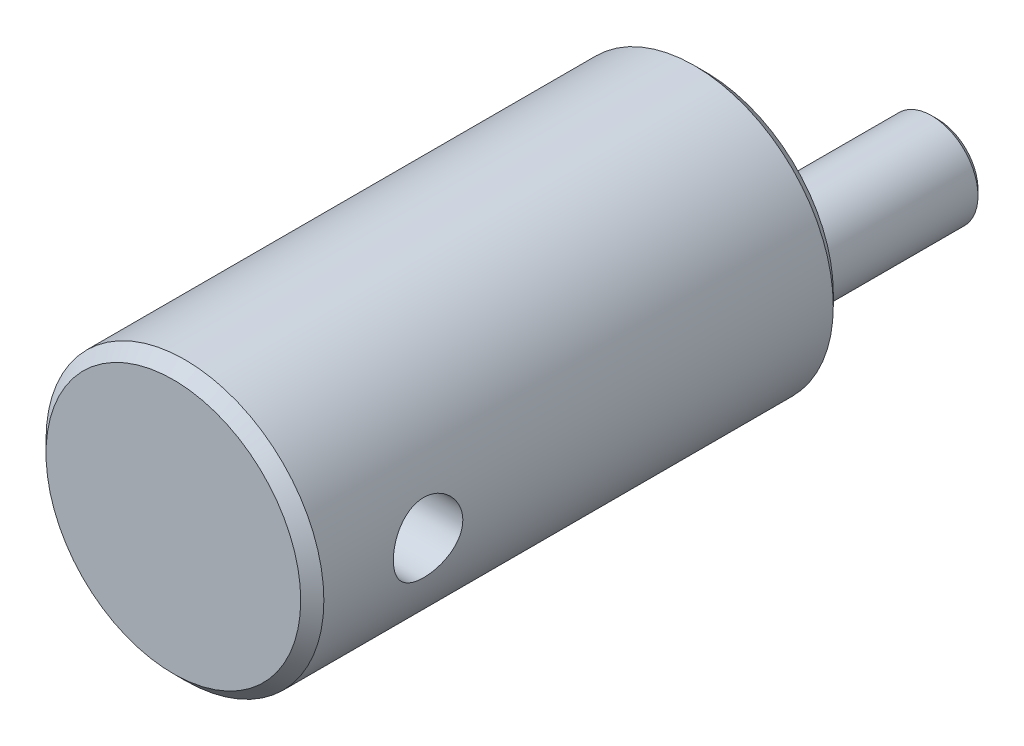
ISO-10303-21;
HEADER;
FILE_DESCRIPTION(('STEP AP214'),'2;1');
FILE_NAME('part.step','',(''),(''),'','','');
FILE_SCHEMA(('AUTOMOTIVE_DESIGN { 1 0 10303 214 1 1 1 1 }'));
ENDSEC;
DATA;
#1=APPLICATION_CONTEXT('core data for automotive mechanical design processes');
#2=APPLICATION_PROTOCOL_DEFINITION('international standard','automotive_design',2000,#1);
#3=PRODUCT_CONTEXT('',#1,'mechanical');
#4=PRODUCT('Part','Part','',(#3));
#5=PRODUCT_RELATED_PRODUCT_CATEGORY('part','',(#4));
#6=PRODUCT_DEFINITION_FORMATION('','',#4);
#7=PRODUCT_DEFINITION_CONTEXT('part definition',#1,'design');
#8=PRODUCT_DEFINITION('design','',#6,#7);
#9=PRODUCT_DEFINITION_SHAPE('','',#8);
#10=(LENGTH_UNIT() NAMED_UNIT(*) SI_UNIT(.MILLI.,.METRE.));
#11=(NAMED_UNIT(*) PLANE_ANGLE_UNIT() SI_UNIT($,.RADIAN.));
#12=(NAMED_UNIT(*) SI_UNIT($,.STERADIAN.) SOLID_ANGLE_UNIT());
#13=UNCERTAINTY_MEASURE_WITH_UNIT(LENGTH_MEASURE(1.E-05),#10,'distance_accuracy_value','');
#14=(GEOMETRIC_REPRESENTATION_CONTEXT(3) GLOBAL_UNCERTAINTY_ASSIGNED_CONTEXT((#13)) GLOBAL_UNIT_ASSIGNED_CONTEXT((#10,
#11,#12)) REPRESENTATION_CONTEXT('',''));
#15=CARTESIAN_POINT('',(0.,0.,0.));
#16=DIRECTION('',(0.,0.,1.));
#17=DIRECTION('',(1.,0.,0.));
#18=AXIS2_PLACEMENT_3D('',#15,#16,#17);
#19=CARTESIAN_POINT('',(0.,0.,23.));
#20=DIRECTION('',(0.,0.,-1.));
#21=DIRECTION('',(-1.,0.,0.));
#22=AXIS2_PLACEMENT_3D('',#19,#20,#21);
#23=CYLINDRICAL_SURFACE('',#22,6.);
#24=CARTESIAN_POINT('',(-6.,0.,16.5));
#25=CARTESIAN_POINT('',(-5.99999859868013,0.082876088669731,16.5000023257382));
#26=CARTESIAN_POINT('',(-5.99826578131828,0.165778157830763,16.5068915507738));
#27=CARTESIAN_POINT('',(-5.99152113829892,0.329206323770532,16.534225151307));
#28=CARTESIAN_POINT('',(-5.98650745419968,0.409731046870739,16.5546772095378));
#29=CARTESIAN_POINT('',(-5.9737562633204,0.566020872182577,16.6084392534621));
#30=CARTESIAN_POINT('',(-5.96602202842087,0.641791563430003,16.6417337987153));
#31=CARTESIAN_POINT('',(-5.94865343807593,0.786672131904426,16.7201813900448));
#32=CARTESIAN_POINT('',(-5.9390190185405,0.855781784348759,16.7653348361189));
#33=CARTESIAN_POINT('',(-5.91867413591801,0.98680192730092,16.8672007896542));
#34=CARTESIAN_POINT('',(-5.90794707148533,1.04855569006107,16.9241115749592));
#35=CARTESIAN_POINT('',(-5.88673620117529,1.1617489272033,17.0474522049089));
#36=CARTESIAN_POINT('',(-5.87625242288348,1.21318723694913,17.1138831229465));
#37=CARTESIAN_POINT('',(-5.8565477569971,1.30502654279903,17.2555952267374));
#38=CARTESIAN_POINT('',(-5.84734794470605,1.34525221592536,17.3309932308104));
#39=CARTESIAN_POINT('',(-5.83149494812223,1.41239690855053,17.4877484116584));
#40=CARTESIAN_POINT('',(-5.82484135672789,1.43931805543933,17.5691046333258));
#41=CARTESIAN_POINT('',(-5.81500476717551,1.47855483680429,17.7337434982025));
#42=CARTESIAN_POINT('',(-5.81175491075426,1.49115226833334,17.8169548960498));
#43=CARTESIAN_POINT('',(-5.80889362537741,1.50226177506785,17.984368569014));
#44=CARTESIAN_POINT('',(-5.80928160448644,1.50077614181798,18.0685706806986));
#45=CARTESIAN_POINT('',(-5.81359205496618,1.48398652463928,18.2334158077445));
#46=CARTESIAN_POINT('',(-5.81742863001879,1.46901834019052,18.3140956214651));
#47=CARTESIAN_POINT('',(-5.82806709676483,1.42622418690311,18.4717610509113));
#48=CARTESIAN_POINT('',(-5.83486919970696,1.39839730206942,18.548746403029));
#49=CARTESIAN_POINT('',(-5.85075113904186,1.33038947793715,18.6977380162521));
#50=CARTESIAN_POINT('',(-5.85985327469421,1.29008666723291,18.7696861717896));
#51=CARTESIAN_POINT('',(-5.87929710846386,1.19835627601496,18.9059187097568));
#52=CARTESIAN_POINT('',(-5.88963902334735,1.14692674880884,18.9702017480673));
#53=CARTESIAN_POINT('',(-5.91075880539781,1.03266342468122,19.0912036156944));
#54=CARTESIAN_POINT('',(-5.92154069477971,0.969546258165863,19.1476544900613));
#55=CARTESIAN_POINT('',(-5.94205965578786,0.834611917503703,19.2492212424639));
#56=CARTESIAN_POINT('',(-5.95179669549415,0.762794477707947,19.2943367742636));
#57=CARTESIAN_POINT('',(-5.96917732094182,0.612115888681395,19.3720505862244));
#58=CARTESIAN_POINT('',(-5.97681360127725,0.533231393208627,19.4046053402544));
#59=CARTESIAN_POINT('',(-5.98907916991418,0.370876008142886,19.4559173057096));
#60=CARTESIAN_POINT('',(-5.99370903339281,0.287405999150487,19.4746771564181));
#61=CARTESIAN_POINT('',(-5.99935499271374,0.120539970390028,19.4974575655588));
#62=CARTESIAN_POINT('',(-6.00046053508279,0.0371967199882111,19.5018430260753));
#63=CARTESIAN_POINT('',(-5.99918804814451,-0.129032874801507,19.4967509979445));
#64=CARTESIAN_POINT('',(-5.99681033241846,-0.211919259644594,19.4872747572009));
#65=CARTESIAN_POINT('',(-5.98889581127357,-0.373614268776491,19.4550290916086));
#66=CARTESIAN_POINT('',(-5.98340634185811,-0.452465118968754,19.432458736523));
#67=CARTESIAN_POINT('',(-5.96988706634134,-0.60525729245251,19.3748929159716));
#68=CARTESIAN_POINT('',(-5.96185700369892,-0.679198119032633,19.3398961956868));
#69=CARTESIAN_POINT('',(-5.9439330792631,-0.821523134429846,19.2577638711253));
#70=CARTESIAN_POINT('',(-5.93400867366932,-0.88978544183583,19.2104238876032));
#71=CARTESIAN_POINT('',(-5.91344509187419,-1.01752661364325,19.105210091203));
#72=CARTESIAN_POINT('',(-5.90280579251705,-1.07700395897301,19.0473344603831));
#73=CARTESIAN_POINT('',(-5.88168956960771,-1.18699056807273,18.9209980391555));
#74=CARTESIAN_POINT('',(-5.87122304187281,-1.23724386762203,18.8523122969976));
#75=CARTESIAN_POINT('',(-5.85192878377239,-1.3255107590127,18.7072673655343));
#76=CARTESIAN_POINT('',(-5.84310098067026,-1.36352489415794,18.6309085170402));
#77=CARTESIAN_POINT('',(-5.82818094734665,-1.42595142060929,18.4730942775869));
#78=CARTESIAN_POINT('',(-5.82207255291905,-1.45044439665407,18.391672371656));
#79=CARTESIAN_POINT('',(-5.81326744090183,-1.48534565995378,18.2256903621109));
#80=CARTESIAN_POINT('',(-5.81056997719936,-1.49575702747866,18.1411309489675));
#81=CARTESIAN_POINT('',(-5.80894901203957,-1.502038590334,17.9738789761448));
#82=CARTESIAN_POINT('',(-5.80991932728264,-1.49831789778012,17.8912025648753));
#83=CARTESIAN_POINT('',(-5.81527909007843,-1.47737727831287,17.727696111332));
#84=CARTESIAN_POINT('',(-5.81966846891857,-1.46015762268677,17.6468660319864));
#85=CARTESIAN_POINT('',(-5.83131260682722,-1.4129313194428,17.4897915409346));
#86=CARTESIAN_POINT('',(-5.83855015236309,-1.38300140468038,17.4135226947598));
#87=CARTESIAN_POINT('',(-5.85507755724829,-1.31126491360507,17.2670346172863));
#88=CARTESIAN_POINT('',(-5.86436770120773,-1.26945669003419,17.1968162268131));
#89=CARTESIAN_POINT('',(-5.88425634263512,-1.17386774863714,17.062445370998));
#90=CARTESIAN_POINT('',(-5.89488264831757,-1.11980316291226,16.998498926576));
#91=CARTESIAN_POINT('',(-5.91608027246286,-1.00178937118974,16.8804529552046));
#92=CARTESIAN_POINT('',(-5.92665157727059,-0.937837821261146,16.826355769887));
#93=CARTESIAN_POINT('',(-5.94677655647663,-0.800467586702591,16.7285886914354));
#94=CARTESIAN_POINT('',(-5.95630833365868,-0.726898422316388,16.6851253863284));
#95=CARTESIAN_POINT('',(-5.97304924975118,-0.573266059510478,16.6112525370595));
#96=CARTESIAN_POINT('',(-5.98026005199781,-0.493207563436742,16.5808336393515));
#97=CARTESIAN_POINT('',(-5.99048059565541,-0.344410253243473,16.5384281696703));
#98=CARTESIAN_POINT('',(-5.9940258505269,-0.276380170908069,16.5240487569466));
#99=CARTESIAN_POINT('',(-5.99878605231948,-0.138906071536283,16.5048340563781));
#100=CARTESIAN_POINT('',(-6.00000117450894,-0.0694621612426164,16.4999980506947));
#101=CARTESIAN_POINT('',(-6.,0.,16.5));
#102=B_SPLINE_CURVE_WITH_KNOTS('',3,(#24,#25,#26,#27,#28,#29,#30,#31,#32,#33,#34,#35,#36,#37,
#38,#39,#40,#41,#42,#43,#44,#45,#46,#47,#48,#49,#50,#51,#52,#53,#54,#55,#56,#57,#58,#59,#60,#61,
#62,#63,#64,#65,#66,#67,#68,#69,#70,#71,#72,#73,#74,#75,#76,#77,#78,#79,#80,#81,#82,#83,#84,#85,
#86,#87,#88,#89,#90,#91,#92,#93,#94,#95,#96,#97,#98,#99,#100,#101),.UNSPECIFIED.,.T.,.F.,(4,2,2,
2,2,2,2,2,2,2,2,2,2,2,2,2,2,2,2,2,2,2,2,2,2,2,2,2,2,2,2,2,2,2,2,2,2,2,4),(0.,0.24837371247189,
0.496888237763899,0.745104902286106,0.993329940169328,1.24614435437139,1.49898729580062,
1.75558647545807,2.01214461169369,2.2635629509943,2.51494038112697,2.76022497007018,
3.00552703466038,3.25330527873879,3.50112690836162,3.75601500969019,4.01091089558247,
4.26668229009114,4.52240473688643,4.77158308949276,5.02073901112743,5.26620274514037,
5.5116912732229,5.76153587565352,6.01142363008019,6.26744509204476,6.52345518749508,
6.77792254614037,7.03233423252408,7.27943780398613,7.52653640956034,7.77216400559448,
8.01782568136901,8.2698957640991,8.52202569770418,8.77872185499588,9.0352336382135,
9.24342242942149,9.4515955604304),.UNSPECIFIED.);
#103=CARTESIAN_POINT('',(-6.,0.,16.5));
#104=VERTEX_POINT('',#103);
#105=EDGE_CURVE('E10',#104,#104,#102,.T.);
#106=ORIENTED_EDGE('',*,*,#105,.T.);
#107=EDGE_LOOP('',(#106));
#108=FACE_BOUND('',#107,.T.);
#109=CARTESIAN_POINT('',(6.,0.,16.5));
#110=CARTESIAN_POINT('',(5.99999859868013,-0.082876088669731,16.5000023257382));
#111=CARTESIAN_POINT('',(5.99826578131828,-0.165778157830763,16.5068915507738));
#112=CARTESIAN_POINT('',(5.99152113829892,-0.329206323770532,16.534225151307));
#113=CARTESIAN_POINT('',(5.98650745419968,-0.409731046870739,16.5546772095378));
#114=CARTESIAN_POINT('',(5.9737562633204,-0.566020872182577,16.6084392534621));
#115=CARTESIAN_POINT('',(5.96602202842087,-0.641791563430003,16.6417337987153));
#116=CARTESIAN_POINT('',(5.94865343807593,-0.786672131904426,16.7201813900448));
#117=CARTESIAN_POINT('',(5.9390190185405,-0.855781784348759,16.7653348361189));
#118=CARTESIAN_POINT('',(5.91867413591801,-0.98680192730092,16.8672007896542));
#119=CARTESIAN_POINT('',(5.90794707148533,-1.04855569006107,16.9241115749592));
#120=CARTESIAN_POINT('',(5.88673620117529,-1.1617489272033,17.0474522049089));
#121=CARTESIAN_POINT('',(5.87625242288348,-1.21318723694913,17.1138831229465));
#122=CARTESIAN_POINT('',(5.8565477569971,-1.30502654279903,17.2555952267374));
#123=CARTESIAN_POINT('',(5.84734794470605,-1.34525221592536,17.3309932308104));
#124=CARTESIAN_POINT('',(5.83149494812223,-1.41239690855053,17.4877484116584));
#125=CARTESIAN_POINT('',(5.82484135672789,-1.43931805543933,17.5691046333258));
#126=CARTESIAN_POINT('',(5.81500476717551,-1.47855483680429,17.7337434982025));
#127=CARTESIAN_POINT('',(5.81175491075426,-1.49115226833334,17.8169548960498));
#128=CARTESIAN_POINT('',(5.80889362537741,-1.50226177506785,17.984368569014));
#129=CARTESIAN_POINT('',(5.80928160448644,-1.50077614181798,18.0685706806986));
#130=CARTESIAN_POINT('',(5.81359205496618,-1.48398652463928,18.2334158077445));
#131=CARTESIAN_POINT('',(5.81742863001879,-1.46901834019052,18.3140956214651));
#132=CARTESIAN_POINT('',(5.82806709676483,-1.42622418690311,18.4717610509113));
#133=CARTESIAN_POINT('',(5.83486919970696,-1.39839730206942,18.548746403029));
#134=CARTESIAN_POINT('',(5.85075113904186,-1.33038947793715,18.6977380162521));
#135=CARTESIAN_POINT('',(5.85985327469421,-1.29008666723291,18.7696861717896));
#136=CARTESIAN_POINT('',(5.87929710846386,-1.19835627601496,18.9059187097568));
#137=CARTESIAN_POINT('',(5.88963902334735,-1.14692674880884,18.9702017480673));
#138=CARTESIAN_POINT('',(5.91075880539781,-1.03266342468122,19.0912036156944));
#139=CARTESIAN_POINT('',(5.92154069477971,-0.969546258165863,19.1476544900613));
#140=CARTESIAN_POINT('',(5.94205965578786,-0.834611917503703,19.2492212424639));
#141=CARTESIAN_POINT('',(5.95179669549415,-0.762794477707947,19.2943367742636));
#142=CARTESIAN_POINT('',(5.96917732094182,-0.612115888681395,19.3720505862244));
#143=CARTESIAN_POINT('',(5.97681360127725,-0.533231393208627,19.4046053402544));
#144=CARTESIAN_POINT('',(5.98907916991418,-0.370876008142886,19.4559173057096));
#145=CARTESIAN_POINT('',(5.99370903339281,-0.287405999150487,19.4746771564181));
#146=CARTESIAN_POINT('',(5.99935499271374,-0.120539970390028,19.4974575655588));
#147=CARTESIAN_POINT('',(6.00046053508279,-0.0371967199882111,19.5018430260753));
#148=CARTESIAN_POINT('',(5.99918804814451,0.129032874801507,19.4967509979445));
#149=CARTESIAN_POINT('',(5.99681033241846,0.211919259644594,19.4872747572009));
#150=CARTESIAN_POINT('',(5.98889581127357,0.373614268776491,19.4550290916086));
#151=CARTESIAN_POINT('',(5.98340634185811,0.452465118968754,19.432458736523));
#152=CARTESIAN_POINT('',(5.96988706634134,0.60525729245251,19.3748929159716));
#153=CARTESIAN_POINT('',(5.96185700369892,0.679198119032633,19.3398961956868));
#154=CARTESIAN_POINT('',(5.9439330792631,0.821523134429846,19.2577638711253));
#155=CARTESIAN_POINT('',(5.93400867366932,0.88978544183583,19.2104238876032));
#156=CARTESIAN_POINT('',(5.91344509187419,1.01752661364325,19.105210091203));
#157=CARTESIAN_POINT('',(5.90280579251705,1.07700395897301,19.0473344603831));
#158=CARTESIAN_POINT('',(5.88168956960771,1.18699056807273,18.9209980391555));
#159=CARTESIAN_POINT('',(5.87122304187281,1.23724386762203,18.8523122969976));
#160=CARTESIAN_POINT('',(5.85192878377239,1.3255107590127,18.7072673655343));
#161=CARTESIAN_POINT('',(5.84310098067026,1.36352489415794,18.6309085170402));
#162=CARTESIAN_POINT('',(5.82818094734665,1.42595142060929,18.4730942775869));
#163=CARTESIAN_POINT('',(5.82207255291905,1.45044439665407,18.391672371656));
#164=CARTESIAN_POINT('',(5.81326744090183,1.48534565995378,18.2256903621109));
#165=CARTESIAN_POINT('',(5.81056997719936,1.49575702747866,18.1411309489675));
#166=CARTESIAN_POINT('',(5.80894901203957,1.502038590334,17.9738789761448));
#167=CARTESIAN_POINT('',(5.80991932728264,1.49831789778012,17.8912025648753));
#168=CARTESIAN_POINT('',(5.81527909007843,1.47737727831287,17.727696111332));
#169=CARTESIAN_POINT('',(5.81966846891857,1.46015762268677,17.6468660319864));
#170=CARTESIAN_POINT('',(5.83131260682722,1.4129313194428,17.4897915409346));
#171=CARTESIAN_POINT('',(5.83855015236309,1.38300140468038,17.4135226947598));
#172=CARTESIAN_POINT('',(5.85507755724829,1.31126491360507,17.2670346172863));
#173=CARTESIAN_POINT('',(5.86436770120773,1.26945669003419,17.1968162268131));
#174=CARTESIAN_POINT('',(5.88425634263512,1.17386774863714,17.062445370998));
#175=CARTESIAN_POINT('',(5.89488264831757,1.11980316291226,16.998498926576));
#176=CARTESIAN_POINT('',(5.91608027246286,1.00178937118974,16.8804529552046));
#177=CARTESIAN_POINT('',(5.92665157727059,0.937837821261146,16.826355769887));
#178=CARTESIAN_POINT('',(5.94677655647663,0.800467586702591,16.7285886914354));
#179=CARTESIAN_POINT('',(5.95630833365868,0.726898422316388,16.6851253863284));
#180=CARTESIAN_POINT('',(5.97304924975118,0.573266059510478,16.6112525370595));
#181=CARTESIAN_POINT('',(5.98026005199781,0.493207563436742,16.5808336393515));
#182=CARTESIAN_POINT('',(5.99048059565541,0.344410253243473,16.5384281696703));
#183=CARTESIAN_POINT('',(5.9940258505269,0.276380170908069,16.5240487569466));
#184=CARTESIAN_POINT('',(5.99878605231948,0.138906071536283,16.5048340563781));
#185=CARTESIAN_POINT('',(6.00000117450894,0.0694621612426164,16.4999980506947));
#186=CARTESIAN_POINT('',(6.,0.,16.5));
#187=B_SPLINE_CURVE_WITH_KNOTS('',3,(#109,#110,#111,#112,#113,#114,#115,#116,#117,#118,#119,
#120,#121,#122,#123,#124,#125,#126,#127,#128,#129,#130,#131,#132,#133,#134,#135,#136,#137,#138,
#139,#140,#141,#142,#143,#144,#145,#146,#147,#148,#149,#150,#151,#152,#153,#154,#155,#156,#157,
#158,#159,#160,#161,#162,#163,#164,#165,#166,#167,#168,#169,#170,#171,#172,#173,#174,#175,#176,
#177,#178,#179,#180,#181,#182,#183,#184,#185,#186),.UNSPECIFIED.,.T.,.F.,(4,2,2,2,2,2,2,2,2,2,2,
2,2,2,2,2,2,2,2,2,2,2,2,2,2,2,2,2,2,2,2,2,2,2,2,2,2,2,4),(0.,0.24837371247189,0.496888237763899,
0.745104902286106,0.993329940169328,1.24614435437139,1.49898729580062,1.75558647545807,
2.01214461169369,2.2635629509943,2.51494038112697,2.76022497007018,3.00552703466038,
3.25330527873879,3.50112690836162,3.75601500969019,4.01091089558247,4.26668229009114,
4.52240473688643,4.77158308949276,5.02073901112743,5.26620274514037,5.5116912732229,
5.76153587565352,6.01142363008019,6.26744509204476,6.52345518749508,6.77792254614037,
7.03233423252408,7.27943780398613,7.52653640956034,7.77216400559448,8.01782568136901,
8.2698957640991,8.52202569770418,8.77872185499588,9.0352336382135,9.24342242942149,
9.4515955604304),.UNSPECIFIED.);
#188=CARTESIAN_POINT('',(6.,0.,16.5));
#189=VERTEX_POINT('',#188);
#190=EDGE_CURVE('E46',#189,#189,#187,.T.);
#191=ORIENTED_EDGE('',*,*,#190,.T.);
#192=EDGE_LOOP('',(#191));
#193=FACE_BOUND('',#192,.T.);
#194=CARTESIAN_POINT('',(0.,0.,0.5));
#195=DIRECTION('',(0.,0.,1.));
#196=DIRECTION('',(1.,0.,0.));
#197=AXIS2_PLACEMENT_3D('',#194,#195,#196);
#198=CIRCLE('',#197,6.);
#199=CARTESIAN_POINT('',(6.,0.,0.5));
#200=VERTEX_POINT('',#199);
#201=EDGE_CURVE('E98',#200,#200,#198,.T.);
#202=ORIENTED_EDGE('',*,*,#201,.T.);
#203=EDGE_LOOP('',(#202));
#204=FACE_BOUND('',#203,.T.);
#205=CARTESIAN_POINT('',(0.,0.,22.5));
#206=DIRECTION('',(0.,0.,1.));
#207=DIRECTION('',(1.,0.,0.));
#208=AXIS2_PLACEMENT_3D('',#205,#206,#207);
#209=CIRCLE('',#208,6.);
#210=CARTESIAN_POINT('',(6.,0.,22.5));
#211=VERTEX_POINT('',#210);
#212=EDGE_CURVE('E101',#211,#211,#209,.F.);
#213=ORIENTED_EDGE('',*,*,#212,.T.);
#214=EDGE_LOOP('',(#213));
#215=FACE_BOUND('',#214,.T.);
#216=ADVANCED_FACE('F33',(#108,#193,#204,#215),#23,.T.);
#217=CARTESIAN_POINT('',(0.,0.,23.));
#218=DIRECTION('',(0.,0.,1.));
#219=DIRECTION('',(1.,0.,0.));
#220=AXIS2_PLACEMENT_3D('',#217,#218,#219);
#221=PLANE('',#220);
#222=CARTESIAN_POINT('',(0.,0.,23.));
#223=DIRECTION('',(0.,0.,1.));
#224=DIRECTION('',(1.,0.,0.));
#225=AXIS2_PLACEMENT_3D('',#222,#223,#224);
#226=CIRCLE('',#225,5.50000000000001);
#227=CARTESIAN_POINT('',(5.50000000000001,0.,23.));
#228=VERTEX_POINT('',#227);
#229=EDGE_CURVE('E109',#228,#228,#226,.T.);
#230=ORIENTED_EDGE('',*,*,#229,.T.);
#231=EDGE_LOOP('',(#230));
#232=FACE_BOUND('',#231,.T.);
#233=ADVANCED_FACE('F78',(#232),#221,.T.);
#234=CARTESIAN_POINT('',(0.,0.,0.));
#235=DIRECTION('',(0.,0.,1.));
#236=DIRECTION('',(1.,0.,0.));
#237=AXIS2_PLACEMENT_3D('',#234,#235,#236);
#238=PLANE('',#237);
#239=CARTESIAN_POINT('',(0.,-3.,0.));
#240=DIRECTION('',(0.,0.,1.));
#241=DIRECTION('',(1.,0.,0.));
#242=AXIS2_PLACEMENT_3D('',#239,#240,#241);
#243=CIRCLE('',#242,2.);
#244=CARTESIAN_POINT('',(2.,-3.,0.));
#245=VERTEX_POINT('',#244);
#246=EDGE_CURVE('E112',#245,#245,#243,.F.);
#247=ORIENTED_EDGE('',*,*,#246,.F.);
#248=EDGE_LOOP('',(#247));
#249=FACE_BOUND('',#248,.T.);
#250=CARTESIAN_POINT('',(0.,0.,0.));
#251=DIRECTION('',(0.,0.,1.));
#252=DIRECTION('',(1.,0.,0.));
#253=AXIS2_PLACEMENT_3D('',#250,#251,#252);
#254=CIRCLE('',#253,5.5);
#255=CARTESIAN_POINT('',(5.5,0.,0.));
#256=VERTEX_POINT('',#255);
#257=EDGE_CURVE('E104',#256,#256,#254,.F.);
#258=ORIENTED_EDGE('',*,*,#257,.T.);
#259=EDGE_LOOP('',(#258));
#260=FACE_BOUND('',#259,.T.);
#261=ADVANCED_FACE('F80',(#249,#260),#238,.F.);
#262=CARTESIAN_POINT('',(0.,0.,0.5));
#263=DIRECTION('',(0.,0.,1.));
#264=DIRECTION('',(1.,0.,0.));
#265=AXIS2_PLACEMENT_3D('',#262,#263,#264);
#266=CONICAL_SURFACE('',#265,6.,0.785398163397449);
#267=ORIENTED_EDGE('',*,*,#257,.F.);
#268=EDGE_LOOP('',(#267));
#269=FACE_BOUND('',#268,.T.);
#270=ORIENTED_EDGE('',*,*,#201,.F.);
#271=EDGE_LOOP('',(#270));
#272=FACE_BOUND('',#271,.T.);
#273=ADVANCED_FACE('F83',(#269,#272),#266,.T.);
#274=CARTESIAN_POINT('',(0.,0.,23.));
#275=DIRECTION('',(0.,0.,-1.));
#276=DIRECTION('',(-1.,0.,0.));
#277=AXIS2_PLACEMENT_3D('',#274,#275,#276);
#278=CONICAL_SURFACE('',#277,5.50000000000001,0.785398163397446);
#279=ORIENTED_EDGE('',*,*,#212,.F.);
#280=EDGE_LOOP('',(#279));
#281=FACE_BOUND('',#280,.T.);
#282=ORIENTED_EDGE('',*,*,#229,.F.);
#283=EDGE_LOOP('',(#282));
#284=FACE_BOUND('',#283,.T.);
#285=ADVANCED_FACE('F76',(#281,#284),#278,.T.);
#286=CARTESIAN_POINT('',(0.,-3.,-10.));
#287=DIRECTION('',(0.,0.,1.));
#288=DIRECTION('',(1.,0.,0.));
#289=AXIS2_PLACEMENT_3D('',#286,#287,#288);
#290=CYLINDRICAL_SURFACE('',#289,2.);
#291=CARTESIAN_POINT('',(0.,-3.,-9.75000000000001));
#292=DIRECTION('',(0.,0.,-1.));
#293=DIRECTION('',(-1.,0.,0.));
#294=AXIS2_PLACEMENT_3D('',#291,#292,#293);
#295=CIRCLE('',#294,2.);
#296=CARTESIAN_POINT('',(-2.,-3.,-9.75000000000001));
#297=VERTEX_POINT('',#296);
#298=EDGE_CURVE('E50',#297,#297,#295,.F.);
#299=ORIENTED_EDGE('',*,*,#298,.T.);
#300=EDGE_LOOP('',(#299));
#301=FACE_BOUND('',#300,.T.);
#302=ORIENTED_EDGE('',*,*,#246,.T.);
#303=EDGE_LOOP('',(#302));
#304=FACE_BOUND('',#303,.T.);
#305=ADVANCED_FACE('F72',(#301,#304),#290,.T.);
#306=CARTESIAN_POINT('',(0.,-3.,-10.));
#307=DIRECTION('',(0.,0.,-1.));
#308=DIRECTION('',(-1.,0.,0.));
#309=AXIS2_PLACEMENT_3D('',#306,#307,#308);
#310=PLANE('',#309);
#311=CARTESIAN_POINT('',(0.,-3.,-10.));
#312=DIRECTION('',(0.,0.,-1.));
#313=DIRECTION('',(-1.,0.,0.));
#314=AXIS2_PLACEMENT_3D('',#311,#312,#313);
#315=CIRCLE('',#314,1.75000000000001);
#316=CARTESIAN_POINT('',(-1.75000000000001,-3.,-10.));
#317=VERTEX_POINT('',#316);
#318=EDGE_CURVE('E54',#317,#317,#315,.T.);
#319=ORIENTED_EDGE('',*,*,#318,.T.);
#320=EDGE_LOOP('',(#319));
#321=FACE_BOUND('',#320,.T.);
#322=ADVANCED_FACE('F68',(#321),#310,.T.);
#323=CARTESIAN_POINT('',(0.,-3.,-10.));
#324=DIRECTION('',(0.,0.,1.));
#325=DIRECTION('',(1.,0.,0.));
#326=AXIS2_PLACEMENT_3D('',#323,#324,#325);
#327=CONICAL_SURFACE('',#326,1.75000000000001,0.785398163397448);
#328=ORIENTED_EDGE('',*,*,#298,.F.);
#329=EDGE_LOOP('',(#328));
#330=FACE_BOUND('',#329,.T.);
#331=ORIENTED_EDGE('',*,*,#318,.F.);
#332=EDGE_LOOP('',(#331));
#333=FACE_BOUND('',#332,.T.);
#334=ADVANCED_FACE('F36',(#330,#333),#327,.T.);
#335=CARTESIAN_POINT('',(-6.,0.,18.));
#336=DIRECTION('',(1.,0.,0.));
#337=DIRECTION('',(0.,0.,-1.));
#338=AXIS2_PLACEMENT_3D('',#335,#336,#337);
#339=CYLINDRICAL_SURFACE('',#338,1.5);
#340=ORIENTED_EDGE('',*,*,#190,.F.);
#341=EDGE_LOOP('',(#340));
#342=FACE_BOUND('',#341,.T.);
#343=ORIENTED_EDGE('',*,*,#105,.F.);
#344=EDGE_LOOP('',(#343));
#345=FACE_BOUND('',#344,.T.);
#346=ADVANCED_FACE('F63',(#342,#345),#339,.F.);
#347=CLOSED_SHELL('',(#216,#233,#261,#273,#285,#305,#322,#334,#346));
#348=MANIFOLD_SOLID_BREP('B2',#347);
#349=ADVANCED_BREP_SHAPE_REPRESENTATION('',(#18,#348),#14);
#350=SHAPE_DEFINITION_REPRESENTATION(#9,#349);
ENDSEC;
END-ISO-10303-21;
